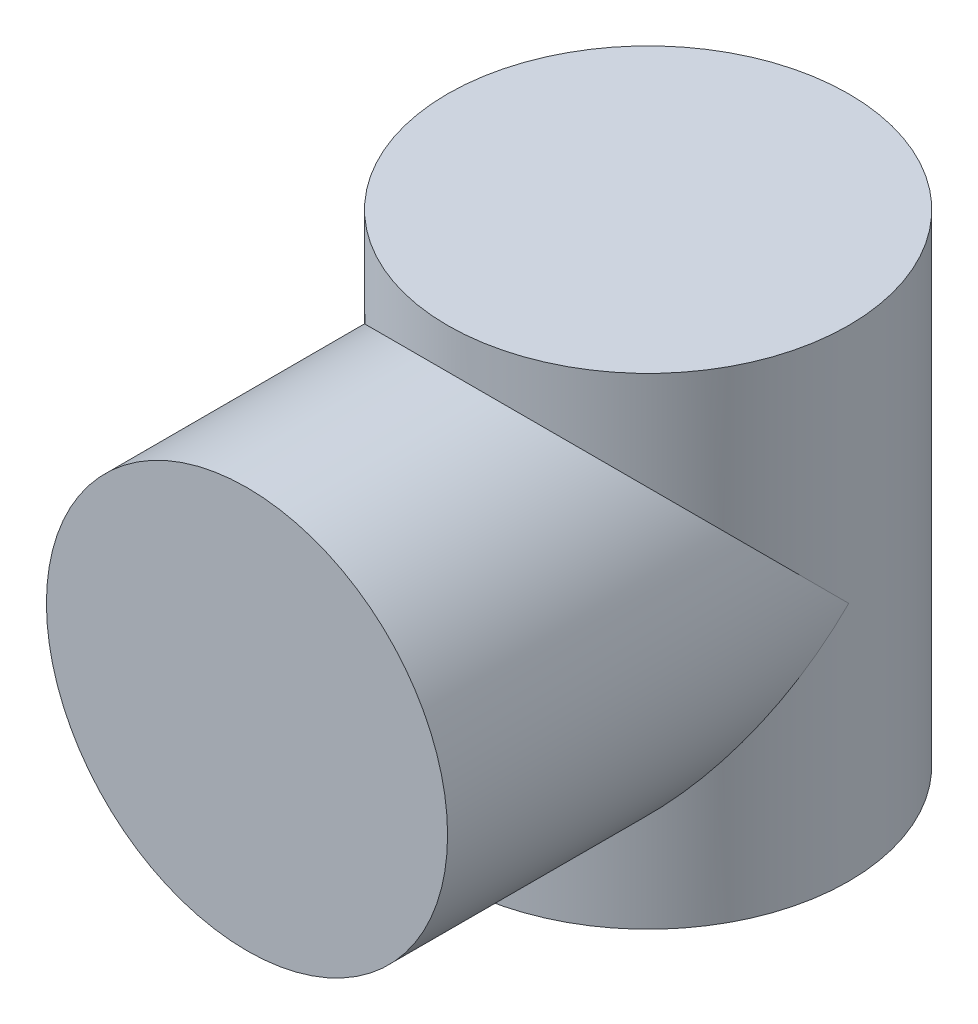
ISO-10303-21;
HEADER;
FILE_DESCRIPTION(('STEP AP214'),'2;1');
FILE_NAME('part.step','',(''),(''),'','','');
FILE_SCHEMA(('AUTOMOTIVE_DESIGN { 1 0 10303 214 1 1 1 1 }'));
ENDSEC;
DATA;
#1=APPLICATION_CONTEXT('core data for automotive mechanical design processes');
#2=APPLICATION_PROTOCOL_DEFINITION('international standard','automotive_design',2000,#1);
#3=PRODUCT_CONTEXT('',#1,'mechanical');
#4=PRODUCT('Part','Part','',(#3));
#5=PRODUCT_RELATED_PRODUCT_CATEGORY('part','',(#4));
#6=PRODUCT_DEFINITION_FORMATION('','',#4);
#7=PRODUCT_DEFINITION_CONTEXT('part definition',#1,'design');
#8=PRODUCT_DEFINITION('design','',#6,#7);
#9=PRODUCT_DEFINITION_SHAPE('','',#8);
#10=(LENGTH_UNIT() NAMED_UNIT(*) SI_UNIT(.MILLI.,.METRE.));
#11=(NAMED_UNIT(*) PLANE_ANGLE_UNIT() SI_UNIT($,.RADIAN.));
#12=(NAMED_UNIT(*) SI_UNIT($,.STERADIAN.) SOLID_ANGLE_UNIT());
#13=UNCERTAINTY_MEASURE_WITH_UNIT(LENGTH_MEASURE(1.E-05),#10,'distance_accuracy_value','');
#14=(GEOMETRIC_REPRESENTATION_CONTEXT(3) GLOBAL_UNCERTAINTY_ASSIGNED_CONTEXT((#13)) GLOBAL_UNIT_ASSIGNED_CONTEXT((#10,
#11,#12)) REPRESENTATION_CONTEXT('',''));
#15=CARTESIAN_POINT('',(0.,0.,0.));
#16=DIRECTION('',(0.,0.,1.));
#17=DIRECTION('',(1.,0.,0.));
#18=AXIS2_PLACEMENT_3D('',#15,#16,#17);
#19=CARTESIAN_POINT('',(0.,60.,0.));
#20=DIRECTION('',(0.,-1.,0.));
#21=DIRECTION('',(0.,0.,-1.));
#22=AXIS2_PLACEMENT_3D('',#19,#20,#21);
#23=CYLINDRICAL_SURFACE('',#22,50.);
#24=CARTESIAN_POINT('',(0.,-60.,0.));
#25=DIRECTION('',(0.,1.,0.));
#26=DIRECTION('',(0.,0.,1.));
#27=AXIS2_PLACEMENT_3D('',#24,#25,#26);
#28=CIRCLE('',#27,50.);
#29=CARTESIAN_POINT('',(0.,-60.,50.));
#30=VERTEX_POINT('',#29);
#31=EDGE_CURVE('E64',#30,#30,#28,.T.);
#32=ORIENTED_EDGE('',*,*,#31,.T.);
#33=EDGE_LOOP('',(#32));
#34=FACE_BOUND('',#33,.T.);
#35=CARTESIAN_POINT('',(0.,60.,0.));
#36=DIRECTION('',(0.,1.,0.));
#37=DIRECTION('',(0.,0.,1.));
#38=AXIS2_PLACEMENT_3D('',#35,#36,#37);
#39=CIRCLE('',#38,50.);
#40=CARTESIAN_POINT('',(0.,60.,50.));
#41=VERTEX_POINT('',#40);
#42=EDGE_CURVE('E62',#41,#41,#39,.T.);
#43=ORIENTED_EDGE('',*,*,#42,.F.);
#44=EDGE_LOOP('',(#43));
#45=FACE_BOUND('',#44,.T.);
#46=CARTESIAN_POINT('',(0.,0.,0.));
#47=DIRECTION('',(0.,-0.707106781186547,-0.707106781186547));
#48=DIRECTION('',(0.,-0.707106781186547,0.707106781186547));
#49=AXIS2_PLACEMENT_3D('',#46,#47,#48);
#50=ELLIPSE('',#49,70.7106781186548,50.);
#51=CARTESIAN_POINT('',(-50.,0.,0.));
#52=VERTEX_POINT('',#51);
#53=CARTESIAN_POINT('',(50.,0.,0.));
#54=VERTEX_POINT('',#53);
#55=EDGE_CURVE('E13',#52,#54,#50,.F.);
#56=ORIENTED_EDGE('',*,*,#55,.F.);
#57=CARTESIAN_POINT('',(0.,0.,0.));
#58=DIRECTION('',(0.,-0.707106781186547,0.707106781186547));
#59=DIRECTION('',(0.,-0.707106781186547,-0.707106781186547));
#60=AXIS2_PLACEMENT_3D('',#57,#58,#59);
#61=ELLIPSE('',#60,70.7106781186548,50.);
#62=EDGE_CURVE('E54',#54,#52,#61,.T.);
#63=ORIENTED_EDGE('',*,*,#62,.F.);
#64=EDGE_LOOP('',(#56,#63));
#65=FACE_BOUND('',#64,.T.);
#66=ADVANCED_FACE('F47',(#34,#45,#65),#23,.T.);
#67=CARTESIAN_POINT('',(0.,60.,0.));
#68=DIRECTION('',(0.,1.,0.));
#69=DIRECTION('',(0.,0.,1.));
#70=AXIS2_PLACEMENT_3D('',#67,#68,#69);
#71=PLANE('',#70);
#72=ORIENTED_EDGE('',*,*,#42,.T.);
#73=EDGE_LOOP('',(#72));
#74=FACE_BOUND('',#73,.T.);
#75=ADVANCED_FACE('F83',(#74),#71,.T.);
#76=CARTESIAN_POINT('',(0.,-60.,0.));
#77=DIRECTION('',(0.,1.,0.));
#78=DIRECTION('',(0.,0.,1.));
#79=AXIS2_PLACEMENT_3D('',#76,#77,#78);
#80=PLANE('',#79);
#81=ORIENTED_EDGE('',*,*,#31,.F.);
#82=EDGE_LOOP('',(#81));
#83=FACE_BOUND('',#82,.T.);
#84=ADVANCED_FACE('F76',(#83),#80,.F.);
#85=CARTESIAN_POINT('',(0.,0.,100.));
#86=DIRECTION('',(0.,0.,-1.));
#87=DIRECTION('',(-1.,0.,0.));
#88=AXIS2_PLACEMENT_3D('',#85,#86,#87);
#89=CYLINDRICAL_SURFACE('',#88,50.);
#90=CARTESIAN_POINT('',(0.,0.,100.));
#91=DIRECTION('',(0.,0.,1.));
#92=DIRECTION('',(1.,0.,0.));
#93=AXIS2_PLACEMENT_3D('',#90,#91,#92);
#94=CIRCLE('',#93,50.);
#95=CARTESIAN_POINT('',(50.,0.,100.));
#96=VERTEX_POINT('',#95);
#97=EDGE_CURVE('E68',#96,#96,#94,.T.);
#98=ORIENTED_EDGE('',*,*,#97,.F.);
#99=EDGE_LOOP('',(#98));
#100=FACE_BOUND('',#99,.T.);
#101=ORIENTED_EDGE('',*,*,#62,.T.);
#102=ORIENTED_EDGE('',*,*,#55,.T.);
#103=EDGE_LOOP('',(#101,#102));
#104=FACE_BOUND('',#103,.T.);
#105=ADVANCED_FACE('F61',(#100,#104),#89,.T.);
#106=CARTESIAN_POINT('',(0.,0.,100.));
#107=DIRECTION('',(0.,0.,1.));
#108=DIRECTION('',(1.,0.,0.));
#109=AXIS2_PLACEMENT_3D('',#106,#107,#108);
#110=PLANE('',#109);
#111=ORIENTED_EDGE('',*,*,#97,.T.);
#112=EDGE_LOOP('',(#111));
#113=FACE_BOUND('',#112,.T.);
#114=ADVANCED_FACE('F73',(#113),#110,.T.);
#115=CLOSED_SHELL('',(#66,#75,#84,#105,#114));
#116=MANIFOLD_SOLID_BREP('B2',#115);
#117=ADVANCED_BREP_SHAPE_REPRESENTATION('',(#18,#116),#14);
#118=SHAPE_DEFINITION_REPRESENTATION(#9,#117);
ENDSEC;
END-ISO-10303-21;
